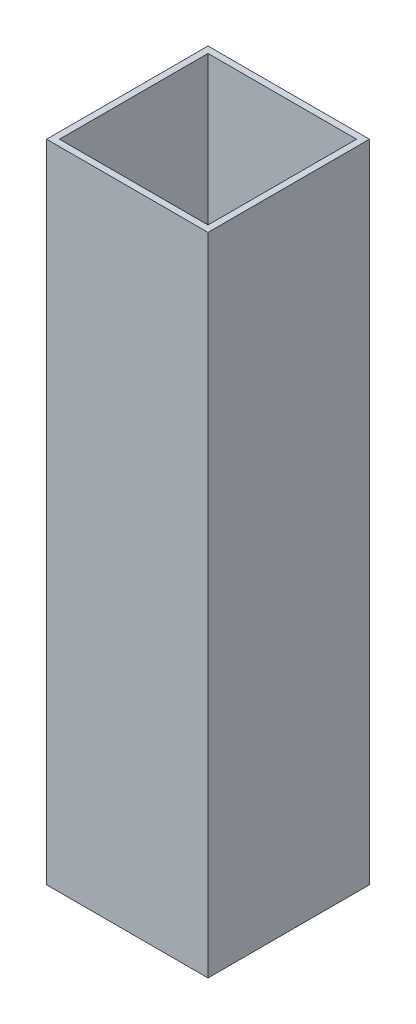
ISO-10303-21;
HEADER;
FILE_DESCRIPTION(('STEP AP214'),'2;1');
FILE_NAME('part.step','',(''),(''),'','','');
FILE_SCHEMA(('AUTOMOTIVE_DESIGN { 1 0 10303 214 1 1 1 1 }'));
ENDSEC;
DATA;
#1=APPLICATION_CONTEXT('core data for automotive mechanical design processes');
#2=APPLICATION_PROTOCOL_DEFINITION('international standard','automotive_design',2000,#1);
#3=PRODUCT_CONTEXT('',#1,'mechanical');
#4=PRODUCT('Part','Part','',(#3));
#5=PRODUCT_RELATED_PRODUCT_CATEGORY('part','',(#4));
#6=PRODUCT_DEFINITION_FORMATION('','',#4);
#7=PRODUCT_DEFINITION_CONTEXT('part definition',#1,'design');
#8=PRODUCT_DEFINITION('design','',#6,#7);
#9=PRODUCT_DEFINITION_SHAPE('','',#8);
#10=(LENGTH_UNIT() NAMED_UNIT(*) SI_UNIT(.MILLI.,.METRE.));
#11=(NAMED_UNIT(*) PLANE_ANGLE_UNIT() SI_UNIT($,.RADIAN.));
#12=(NAMED_UNIT(*) SI_UNIT($,.STERADIAN.) SOLID_ANGLE_UNIT());
#13=UNCERTAINTY_MEASURE_WITH_UNIT(LENGTH_MEASURE(1.E-05),#10,'distance_accuracy_value','');
#14=(GEOMETRIC_REPRESENTATION_CONTEXT(3) GLOBAL_UNCERTAINTY_ASSIGNED_CONTEXT((#13)) GLOBAL_UNIT_ASSIGNED_CONTEXT((#10,
#11,#12)) REPRESENTATION_CONTEXT('',''));
#15=CARTESIAN_POINT('',(0.,0.,0.));
#16=DIRECTION('',(0.,0.,1.));
#17=DIRECTION('',(1.,0.,0.));
#18=AXIS2_PLACEMENT_3D('',#15,#16,#17);
#19=CARTESIAN_POINT('',(0.,200.,0.));
#20=DIRECTION('',(0.,-1.,0.));
#21=DIRECTION('',(0.,0.,-1.));
#22=AXIS2_PLACEMENT_3D('',#19,#20,#21);
#23=PLANE('',#22);
#24=DIRECTION('',(0.,0.,-1.));
#25=VECTOR('',#24,1.);
#26=CARTESIAN_POINT('',(25.,200.,25.));
#27=LINE('',#26,#25);
#28=CARTESIAN_POINT('',(25.,200.,25.));
#29=VERTEX_POINT('',#28);
#30=CARTESIAN_POINT('',(25.,200.,-25.));
#31=VERTEX_POINT('',#30);
#32=EDGE_CURVE('E153',#29,#31,#27,.T.);
#33=ORIENTED_EDGE('',*,*,#32,.T.);
#34=DIRECTION('',(-1.,0.,0.));
#35=VECTOR('',#34,1.);
#36=CARTESIAN_POINT('',(-25.,200.,-25.));
#37=LINE('',#36,#35);
#38=CARTESIAN_POINT('',(-25.,200.,-25.));
#39=VERTEX_POINT('',#38);
#40=EDGE_CURVE('E157',#31,#39,#37,.T.);
#41=ORIENTED_EDGE('',*,*,#40,.T.);
#42=DIRECTION('',(0.,0.,1.));
#43=VECTOR('',#42,1.);
#44=CARTESIAN_POINT('',(-25.,200.,25.));
#45=LINE('',#44,#43);
#46=CARTESIAN_POINT('',(-25.,200.,25.));
#47=VERTEX_POINT('',#46);
#48=EDGE_CURVE('E161',#39,#47,#45,.T.);
#49=ORIENTED_EDGE('',*,*,#48,.T.);
#50=DIRECTION('',(1.,0.,0.));
#51=VECTOR('',#50,1.);
#52=CARTESIAN_POINT('',(-25.,200.,25.));
#53=LINE('',#52,#51);
#54=EDGE_CURVE('E164',#47,#29,#53,.T.);
#55=ORIENTED_EDGE('',*,*,#54,.T.);
#56=EDGE_LOOP('',(#33,#41,#49,#55));
#57=FACE_BOUND('',#56,.T.);
#58=DIRECTION('',(0.,0.,1.));
#59=VECTOR('',#58,1.);
#60=CARTESIAN_POINT('',(-23.,200.,23.));
#61=LINE('',#60,#59);
#62=CARTESIAN_POINT('',(-23.,200.,-23.));
#63=VERTEX_POINT('',#62);
#64=CARTESIAN_POINT('',(-23.,200.,23.));
#65=VERTEX_POINT('',#64);
#66=EDGE_CURVE('E105',#63,#65,#61,.T.);
#67=ORIENTED_EDGE('',*,*,#66,.F.);
#68=DIRECTION('',(-1.,0.,0.));
#69=VECTOR('',#68,1.);
#70=CARTESIAN_POINT('',(-23.,200.,-23.));
#71=LINE('',#70,#69);
#72=CARTESIAN_POINT('',(23.,200.,-23.));
#73=VERTEX_POINT('',#72);
#74=EDGE_CURVE('E131',#73,#63,#71,.T.);
#75=ORIENTED_EDGE('',*,*,#74,.F.);
#76=DIRECTION('',(0.,0.,-1.));
#77=VECTOR('',#76,1.);
#78=CARTESIAN_POINT('',(23.,200.,23.));
#79=LINE('',#78,#77);
#80=CARTESIAN_POINT('',(23.,200.,23.));
#81=VERTEX_POINT('',#80);
#82=EDGE_CURVE('E127',#81,#73,#79,.T.);
#83=ORIENTED_EDGE('',*,*,#82,.F.);
#84=DIRECTION('',(1.,0.,0.));
#85=VECTOR('',#84,1.);
#86=CARTESIAN_POINT('',(-23.,200.,23.));
#87=LINE('',#86,#85);
#88=EDGE_CURVE('E114',#65,#81,#87,.T.);
#89=ORIENTED_EDGE('',*,*,#88,.F.);
#90=EDGE_LOOP('',(#67,#75,#83,#89));
#91=FACE_BOUND('',#90,.T.);
#92=ADVANCED_FACE('F39',(#57,#91),#23,.F.);
#93=CARTESIAN_POINT('',(0.,0.,0.));
#94=DIRECTION('',(0.,-1.,0.));
#95=DIRECTION('',(0.,0.,-1.));
#96=AXIS2_PLACEMENT_3D('',#93,#94,#95);
#97=PLANE('',#96);
#98=DIRECTION('',(0.,0.,-1.));
#99=VECTOR('',#98,1.);
#100=CARTESIAN_POINT('',(25.,0.,25.));
#101=LINE('',#100,#99);
#102=CARTESIAN_POINT('',(25.,0.,25.));
#103=VERTEX_POINT('',#102);
#104=CARTESIAN_POINT('',(25.,0.,-25.));
#105=VERTEX_POINT('',#104);
#106=EDGE_CURVE('E123',#103,#105,#101,.T.);
#107=ORIENTED_EDGE('',*,*,#106,.F.);
#108=DIRECTION('',(1.,0.,0.));
#109=VECTOR('',#108,1.);
#110=CARTESIAN_POINT('',(-25.,0.,25.));
#111=LINE('',#110,#109);
#112=CARTESIAN_POINT('',(-25.,0.,25.));
#113=VERTEX_POINT('',#112);
#114=EDGE_CURVE('E158',#113,#103,#111,.T.);
#115=ORIENTED_EDGE('',*,*,#114,.F.);
#116=DIRECTION('',(0.,0.,1.));
#117=VECTOR('',#116,1.);
#118=CARTESIAN_POINT('',(-25.,0.,25.));
#119=LINE('',#118,#117);
#120=CARTESIAN_POINT('',(-25.,0.,-25.));
#121=VERTEX_POINT('',#120);
#122=EDGE_CURVE('E174',#121,#113,#119,.T.);
#123=ORIENTED_EDGE('',*,*,#122,.F.);
#124=DIRECTION('',(-1.,0.,0.));
#125=VECTOR('',#124,1.);
#126=CARTESIAN_POINT('',(-25.,0.,-25.));
#127=LINE('',#126,#125);
#128=EDGE_CURVE('E171',#105,#121,#127,.T.);
#129=ORIENTED_EDGE('',*,*,#128,.F.);
#130=EDGE_LOOP('',(#107,#115,#123,#129));
#131=FACE_BOUND('',#130,.T.);
#132=DIRECTION('',(-1.,0.,0.));
#133=VECTOR('',#132,1.);
#134=CARTESIAN_POINT('',(-23.,0.,-23.));
#135=LINE('',#134,#133);
#136=CARTESIAN_POINT('',(23.,0.,-23.));
#137=VERTEX_POINT('',#136);
#138=CARTESIAN_POINT('',(-23.,0.,-23.));
#139=VERTEX_POINT('',#138);
#140=EDGE_CURVE('E115',#137,#139,#135,.T.);
#141=ORIENTED_EDGE('',*,*,#140,.T.);
#142=DIRECTION('',(0.,0.,1.));
#143=VECTOR('',#142,1.);
#144=CARTESIAN_POINT('',(-23.,0.,23.));
#145=LINE('',#144,#143);
#146=CARTESIAN_POINT('',(-23.,0.,23.));
#147=VERTEX_POINT('',#146);
#148=EDGE_CURVE('E63',#139,#147,#145,.T.);
#149=ORIENTED_EDGE('',*,*,#148,.T.);
#150=DIRECTION('',(1.,0.,0.));
#151=VECTOR('',#150,1.);
#152=CARTESIAN_POINT('',(-23.,0.,23.));
#153=LINE('',#152,#151);
#154=CARTESIAN_POINT('',(23.,0.,23.));
#155=VERTEX_POINT('',#154);
#156=EDGE_CURVE('E121',#147,#155,#153,.T.);
#157=ORIENTED_EDGE('',*,*,#156,.T.);
#158=DIRECTION('',(0.,0.,-1.));
#159=VECTOR('',#158,1.);
#160=CARTESIAN_POINT('',(23.,0.,23.));
#161=LINE('',#160,#159);
#162=EDGE_CURVE('E140',#155,#137,#161,.T.);
#163=ORIENTED_EDGE('',*,*,#162,.T.);
#164=EDGE_LOOP('',(#141,#149,#157,#163));
#165=FACE_BOUND('',#164,.T.);
#166=ADVANCED_FACE('F197',(#131,#165),#97,.T.);
#167=CARTESIAN_POINT('',(25.,200.,25.));
#168=DIRECTION('',(-1.,0.,0.));
#169=DIRECTION('',(0.,0.,1.));
#170=AXIS2_PLACEMENT_3D('',#167,#168,#169);
#171=PLANE('',#170);
#172=ORIENTED_EDGE('',*,*,#106,.T.);
#173=DIRECTION('',(0.,-1.,0.));
#174=VECTOR('',#173,1.);
#175=CARTESIAN_POINT('',(25.,200.,-25.));
#176=LINE('',#175,#174);
#177=EDGE_CURVE('E11',#31,#105,#176,.T.);
#178=ORIENTED_EDGE('',*,*,#177,.F.);
#179=ORIENTED_EDGE('',*,*,#32,.F.);
#180=DIRECTION('',(0.,-1.,0.));
#181=VECTOR('',#180,1.);
#182=CARTESIAN_POINT('',(25.,200.,25.));
#183=LINE('',#182,#181);
#184=EDGE_CURVE('E167',#29,#103,#183,.T.);
#185=ORIENTED_EDGE('',*,*,#184,.T.);
#186=EDGE_LOOP('',(#172,#178,#179,#185));
#187=FACE_BOUND('',#186,.T.);
#188=ADVANCED_FACE('F41',(#187),#171,.F.);
#189=CARTESIAN_POINT('',(-25.,200.,-25.));
#190=DIRECTION('',(0.,0.,1.));
#191=DIRECTION('',(1.,0.,0.));
#192=AXIS2_PLACEMENT_3D('',#189,#190,#191);
#193=PLANE('',#192);
#194=ORIENTED_EDGE('',*,*,#128,.T.);
#195=DIRECTION('',(0.,-1.,0.));
#196=VECTOR('',#195,1.);
#197=CARTESIAN_POINT('',(-25.,200.,-25.));
#198=LINE('',#197,#196);
#199=EDGE_CURVE('E48',#39,#121,#198,.T.);
#200=ORIENTED_EDGE('',*,*,#199,.F.);
#201=ORIENTED_EDGE('',*,*,#40,.F.);
#202=ORIENTED_EDGE('',*,*,#177,.T.);
#203=EDGE_LOOP('',(#194,#200,#201,#202));
#204=FACE_BOUND('',#203,.T.);
#205=ADVANCED_FACE('F207',(#204),#193,.F.);
#206=CARTESIAN_POINT('',(-25.,200.,25.));
#207=DIRECTION('',(1.,0.,0.));
#208=DIRECTION('',(0.,0.,-1.));
#209=AXIS2_PLACEMENT_3D('',#206,#207,#208);
#210=PLANE('',#209);
#211=ORIENTED_EDGE('',*,*,#122,.T.);
#212=DIRECTION('',(0.,-1.,0.));
#213=VECTOR('',#212,1.);
#214=CARTESIAN_POINT('',(-25.,200.,25.));
#215=LINE('',#214,#213);
#216=EDGE_CURVE('E182',#47,#113,#215,.T.);
#217=ORIENTED_EDGE('',*,*,#216,.F.);
#218=ORIENTED_EDGE('',*,*,#48,.F.);
#219=ORIENTED_EDGE('',*,*,#199,.T.);
#220=EDGE_LOOP('',(#211,#217,#218,#219));
#221=FACE_BOUND('',#220,.T.);
#222=ADVANCED_FACE('F191',(#221),#210,.F.);
#223=CARTESIAN_POINT('',(-25.,200.,25.));
#224=DIRECTION('',(0.,0.,-1.));
#225=DIRECTION('',(-1.,0.,0.));
#226=AXIS2_PLACEMENT_3D('',#223,#224,#225);
#227=PLANE('',#226);
#228=ORIENTED_EDGE('',*,*,#114,.T.);
#229=ORIENTED_EDGE('',*,*,#184,.F.);
#230=ORIENTED_EDGE('',*,*,#54,.F.);
#231=ORIENTED_EDGE('',*,*,#216,.T.);
#232=EDGE_LOOP('',(#228,#229,#230,#231));
#233=FACE_BOUND('',#232,.T.);
#234=ADVANCED_FACE('F201',(#233),#227,.F.);
#235=CARTESIAN_POINT('',(-23.,200.,23.));
#236=DIRECTION('',(1.,0.,0.));
#237=DIRECTION('',(0.,0.,-1.));
#238=AXIS2_PLACEMENT_3D('',#235,#236,#237);
#239=PLANE('',#238);
#240=ORIENTED_EDGE('',*,*,#148,.F.);
#241=DIRECTION('',(0.,-1.,0.));
#242=VECTOR('',#241,1.);
#243=CARTESIAN_POINT('',(-23.,200.,-23.));
#244=LINE('',#243,#242);
#245=EDGE_CURVE('E109',#63,#139,#244,.T.);
#246=ORIENTED_EDGE('',*,*,#245,.F.);
#247=ORIENTED_EDGE('',*,*,#66,.T.);
#248=DIRECTION('',(0.,-1.,0.));
#249=VECTOR('',#248,1.);
#250=CARTESIAN_POINT('',(-23.,200.,23.));
#251=LINE('',#250,#249);
#252=EDGE_CURVE('E108',#65,#147,#251,.T.);
#253=ORIENTED_EDGE('',*,*,#252,.T.);
#254=EDGE_LOOP('',(#240,#246,#247,#253));
#255=FACE_BOUND('',#254,.T.);
#256=ADVANCED_FACE('F107',(#255),#239,.T.);
#257=CARTESIAN_POINT('',(-23.,200.,23.));
#258=DIRECTION('',(0.,0.,-1.));
#259=DIRECTION('',(-1.,0.,0.));
#260=AXIS2_PLACEMENT_3D('',#257,#258,#259);
#261=PLANE('',#260);
#262=ORIENTED_EDGE('',*,*,#156,.F.);
#263=ORIENTED_EDGE('',*,*,#252,.F.);
#264=ORIENTED_EDGE('',*,*,#88,.T.);
#265=DIRECTION('',(0.,-1.,0.));
#266=VECTOR('',#265,1.);
#267=CARTESIAN_POINT('',(23.,200.,23.));
#268=LINE('',#267,#266);
#269=EDGE_CURVE('E124',#81,#155,#268,.T.);
#270=ORIENTED_EDGE('',*,*,#269,.T.);
#271=EDGE_LOOP('',(#262,#263,#264,#270));
#272=FACE_BOUND('',#271,.T.);
#273=ADVANCED_FACE('F118',(#272),#261,.T.);
#274=CARTESIAN_POINT('',(23.,200.,23.));
#275=DIRECTION('',(-1.,0.,0.));
#276=DIRECTION('',(0.,0.,1.));
#277=AXIS2_PLACEMENT_3D('',#274,#275,#276);
#278=PLANE('',#277);
#279=ORIENTED_EDGE('',*,*,#162,.F.);
#280=ORIENTED_EDGE('',*,*,#269,.F.);
#281=ORIENTED_EDGE('',*,*,#82,.T.);
#282=DIRECTION('',(0.,-1.,0.));
#283=VECTOR('',#282,1.);
#284=CARTESIAN_POINT('',(23.,200.,-23.));
#285=LINE('',#284,#283);
#286=EDGE_CURVE('E55',#73,#137,#285,.T.);
#287=ORIENTED_EDGE('',*,*,#286,.T.);
#288=EDGE_LOOP('',(#279,#280,#281,#287));
#289=FACE_BOUND('',#288,.T.);
#290=ADVANCED_FACE('F230',(#289),#278,.T.);
#291=CARTESIAN_POINT('',(-23.,200.,-23.));
#292=DIRECTION('',(0.,0.,1.));
#293=DIRECTION('',(1.,0.,0.));
#294=AXIS2_PLACEMENT_3D('',#291,#292,#293);
#295=PLANE('',#294);
#296=ORIENTED_EDGE('',*,*,#140,.F.);
#297=ORIENTED_EDGE('',*,*,#286,.F.);
#298=ORIENTED_EDGE('',*,*,#74,.T.);
#299=ORIENTED_EDGE('',*,*,#245,.T.);
#300=EDGE_LOOP('',(#296,#297,#298,#299));
#301=FACE_BOUND('',#300,.T.);
#302=ADVANCED_FACE('F234',(#301),#295,.T.);
#303=CLOSED_SHELL('',(#92,#166,#188,#205,#222,#234,#256,#273,#290,#302));
#304=MANIFOLD_SOLID_BREP('B2',#303);
#305=ADVANCED_BREP_SHAPE_REPRESENTATION('',(#18,#304),#14);
#306=SHAPE_DEFINITION_REPRESENTATION(#9,#305);
ENDSEC;
END-ISO-10303-21;
